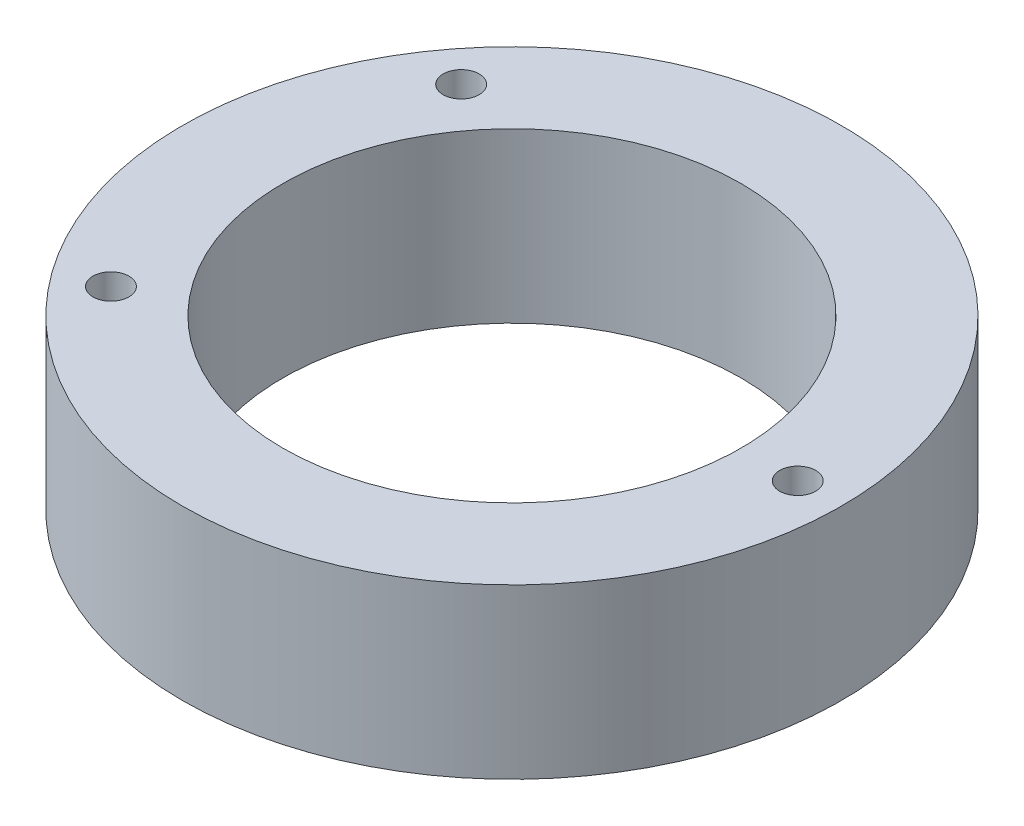
ISO-10303-21;
HEADER;
FILE_DESCRIPTION(('STEP AP214'),'2;1');
FILE_NAME('part.step','',(''),(''),'','','');
FILE_SCHEMA(('AUTOMOTIVE_DESIGN { 1 0 10303 214 1 1 1 1 }'));
ENDSEC;
DATA;
#1=APPLICATION_CONTEXT('core data for automotive mechanical design processes');
#2=APPLICATION_PROTOCOL_DEFINITION('international standard','automotive_design',2000,#1);
#3=PRODUCT_CONTEXT('',#1,'mechanical');
#4=PRODUCT('Part','Part','',(#3));
#5=PRODUCT_RELATED_PRODUCT_CATEGORY('part','',(#4));
#6=PRODUCT_DEFINITION_FORMATION('','',#4);
#7=PRODUCT_DEFINITION_CONTEXT('part definition',#1,'design');
#8=PRODUCT_DEFINITION('design','',#6,#7);
#9=PRODUCT_DEFINITION_SHAPE('','',#8);
#10=(LENGTH_UNIT() NAMED_UNIT(*) SI_UNIT(.MILLI.,.METRE.));
#11=(NAMED_UNIT(*) PLANE_ANGLE_UNIT() SI_UNIT($,.RADIAN.));
#12=(NAMED_UNIT(*) SI_UNIT($,.STERADIAN.) SOLID_ANGLE_UNIT());
#13=UNCERTAINTY_MEASURE_WITH_UNIT(LENGTH_MEASURE(1.E-05),#10,'distance_accuracy_value','');
#14=(GEOMETRIC_REPRESENTATION_CONTEXT(3) GLOBAL_UNCERTAINTY_ASSIGNED_CONTEXT((#13)) GLOBAL_UNIT_ASSIGNED_CONTEXT((#10,
#11,#12)) REPRESENTATION_CONTEXT('',''));
#15=CARTESIAN_POINT('',(0.,0.,0.));
#16=DIRECTION('',(0.,0.,1.));
#17=DIRECTION('',(1.,0.,0.));
#18=AXIS2_PLACEMENT_3D('',#15,#16,#17);
#19=CARTESIAN_POINT('',(0.,-3.35,0.));
#20=DIRECTION('',(0.,1.,0.));
#21=DIRECTION('',(0.,0.,1.));
#22=AXIS2_PLACEMENT_3D('',#19,#20,#21);
#23=CYLINDRICAL_SURFACE('',#22,32.);
#24=CARTESIAN_POINT('',(0.,-3.35,0.));
#25=DIRECTION('',(0.,1.,0.));
#26=DIRECTION('',(0.,0.,1.));
#27=AXIS2_PLACEMENT_3D('',#24,#25,#26);
#28=CIRCLE('',#27,32.);
#29=CARTESIAN_POINT('',(0.,-3.35,32.));
#30=VERTEX_POINT('',#29);
#31=EDGE_CURVE('E10',#30,#30,#28,.T.);
#32=ORIENTED_EDGE('',*,*,#31,.T.);
#33=EDGE_LOOP('',(#32));
#34=FACE_BOUND('',#33,.T.);
#35=CARTESIAN_POINT('',(0.,13.,0.));
#36=DIRECTION('',(0.,1.,0.));
#37=DIRECTION('',(0.,0.,1.));
#38=AXIS2_PLACEMENT_3D('',#35,#36,#37);
#39=CIRCLE('',#38,32.);
#40=CARTESIAN_POINT('',(0.,13.,32.));
#41=VERTEX_POINT('',#40);
#42=EDGE_CURVE('E65',#41,#41,#39,.T.);
#43=ORIENTED_EDGE('',*,*,#42,.F.);
#44=EDGE_LOOP('',(#43));
#45=FACE_BOUND('',#44,.T.);
#46=ADVANCED_FACE('F43',(#34,#45),#23,.T.);
#47=CARTESIAN_POINT('',(0.,-3.35,0.));
#48=DIRECTION('',(0.,1.,0.));
#49=DIRECTION('',(0.,0.,1.));
#50=AXIS2_PLACEMENT_3D('',#47,#48,#49);
#51=PLANE('',#50);
#52=CARTESIAN_POINT('',(-21.9312535706419,-3.35,17.0024297328413));
#53=DIRECTION('',(0.,1.,0.));
#54=DIRECTION('',(0.,0.,1.));
#55=AXIS2_PLACEMENT_3D('',#52,#53,#54);
#56=CIRCLE('',#55,1.75);
#57=CARTESIAN_POINT('',(-21.9312535706419,-3.35,18.7524297328413));
#58=VERTEX_POINT('',#57);
#59=EDGE_CURVE('E62',#58,#58,#56,.T.);
#60=ORIENTED_EDGE('',*,*,#59,.T.);
#61=EDGE_LOOP('',(#60));
#62=FACE_BOUND('',#61,.T.);
#63=CARTESIAN_POINT('',(-21.9312535706419,-3.35,-17.0024297328413));
#64=DIRECTION('',(0.,1.,0.));
#65=DIRECTION('',(0.,0.,1.));
#66=AXIS2_PLACEMENT_3D('',#63,#64,#65);
#67=CIRCLE('',#66,1.75);
#68=CARTESIAN_POINT('',(-21.9312535706419,-3.35,-15.2524297328413));
#69=VERTEX_POINT('',#68);
#70=EDGE_CURVE('E57',#69,#69,#67,.T.);
#71=ORIENTED_EDGE('',*,*,#70,.T.);
#72=EDGE_LOOP('',(#71));
#73=FACE_BOUND('',#72,.T.);
#74=CARTESIAN_POINT('',(27.75,-3.35,0.));
#75=DIRECTION('',(0.,1.,0.));
#76=DIRECTION('',(0.,0.,1.));
#77=AXIS2_PLACEMENT_3D('',#74,#75,#76);
#78=CIRCLE('',#77,1.75);
#79=CARTESIAN_POINT('',(27.75,-3.35,1.75));
#80=VERTEX_POINT('',#79);
#81=EDGE_CURVE('E53',#80,#80,#78,.T.);
#82=ORIENTED_EDGE('',*,*,#81,.T.);
#83=EDGE_LOOP('',(#82));
#84=FACE_BOUND('',#83,.T.);
#85=CARTESIAN_POINT('',(0.,-3.35,0.));
#86=DIRECTION('',(0.,1.,0.));
#87=DIRECTION('',(0.,0.,1.));
#88=AXIS2_PLACEMENT_3D('',#85,#86,#87);
#89=CIRCLE('',#88,22.25);
#90=CARTESIAN_POINT('',(0.,-3.35,22.25));
#91=VERTEX_POINT('',#90);
#92=EDGE_CURVE('E49',#91,#91,#89,.T.);
#93=ORIENTED_EDGE('',*,*,#92,.T.);
#94=EDGE_LOOP('',(#93));
#95=FACE_BOUND('',#94,.T.);
#96=ORIENTED_EDGE('',*,*,#31,.F.);
#97=EDGE_LOOP('',(#96));
#98=FACE_BOUND('',#97,.T.);
#99=ADVANCED_FACE('F96',(#62,#73,#84,#95,#98),#51,.F.);
#100=CARTESIAN_POINT('',(0.,-3.35,0.));
#101=DIRECTION('',(0.,1.,0.));
#102=DIRECTION('',(0.,0.,1.));
#103=AXIS2_PLACEMENT_3D('',#100,#101,#102);
#104=CYLINDRICAL_SURFACE('',#103,22.25);
#105=ORIENTED_EDGE('',*,*,#92,.F.);
#106=EDGE_LOOP('',(#105));
#107=FACE_BOUND('',#106,.T.);
#108=CARTESIAN_POINT('',(0.,13.,0.));
#109=DIRECTION('',(0.,1.,0.));
#110=DIRECTION('',(0.,0.,1.));
#111=AXIS2_PLACEMENT_3D('',#108,#109,#110);
#112=CIRCLE('',#111,22.25);
#113=CARTESIAN_POINT('',(0.,13.,22.25));
#114=VERTEX_POINT('',#113);
#115=EDGE_CURVE('E68',#114,#114,#112,.T.);
#116=ORIENTED_EDGE('',*,*,#115,.T.);
#117=EDGE_LOOP('',(#116));
#118=FACE_BOUND('',#117,.T.);
#119=ADVANCED_FACE('F100',(#107,#118),#104,.F.);
#120=CARTESIAN_POINT('',(27.75,-3.35,0.));
#121=DIRECTION('',(0.,1.,0.));
#122=DIRECTION('',(0.,0.,1.));
#123=AXIS2_PLACEMENT_3D('',#120,#121,#122);
#124=CYLINDRICAL_SURFACE('',#123,1.75);
#125=ORIENTED_EDGE('',*,*,#81,.F.);
#126=EDGE_LOOP('',(#125));
#127=FACE_BOUND('',#126,.T.);
#128=CARTESIAN_POINT('',(27.75,13.,0.));
#129=DIRECTION('',(0.,1.,0.));
#130=DIRECTION('',(0.,0.,1.));
#131=AXIS2_PLACEMENT_3D('',#128,#129,#130);
#132=CIRCLE('',#131,1.75);
#133=CARTESIAN_POINT('',(27.75,13.,1.75));
#134=VERTEX_POINT('',#133);
#135=EDGE_CURVE('E71',#134,#134,#132,.T.);
#136=ORIENTED_EDGE('',*,*,#135,.T.);
#137=EDGE_LOOP('',(#136));
#138=FACE_BOUND('',#137,.T.);
#139=ADVANCED_FACE('F108',(#127,#138),#124,.F.);
#140=CARTESIAN_POINT('',(-21.9312535706419,-3.35,-17.0024297328413));
#141=DIRECTION('',(0.,1.,0.));
#142=DIRECTION('',(0.,0.,1.));
#143=AXIS2_PLACEMENT_3D('',#140,#141,#142);
#144=CYLINDRICAL_SURFACE('',#143,1.75);
#145=ORIENTED_EDGE('',*,*,#70,.F.);
#146=EDGE_LOOP('',(#145));
#147=FACE_BOUND('',#146,.T.);
#148=CARTESIAN_POINT('',(-21.9312535706419,13.,-17.0024297328413));
#149=DIRECTION('',(0.,1.,0.));
#150=DIRECTION('',(0.,0.,1.));
#151=AXIS2_PLACEMENT_3D('',#148,#149,#150);
#152=CIRCLE('',#151,1.75);
#153=CARTESIAN_POINT('',(-21.9312535706419,13.,-15.2524297328413));
#154=VERTEX_POINT('',#153);
#155=EDGE_CURVE('E74',#154,#154,#152,.T.);
#156=ORIENTED_EDGE('',*,*,#155,.T.);
#157=EDGE_LOOP('',(#156));
#158=FACE_BOUND('',#157,.T.);
#159=ADVANCED_FACE('F90',(#147,#158),#144,.F.);
#160=CARTESIAN_POINT('',(-21.9312535706419,-3.35,17.0024297328413));
#161=DIRECTION('',(0.,1.,0.));
#162=DIRECTION('',(0.,0.,1.));
#163=AXIS2_PLACEMENT_3D('',#160,#161,#162);
#164=CYLINDRICAL_SURFACE('',#163,1.75);
#165=ORIENTED_EDGE('',*,*,#59,.F.);
#166=EDGE_LOOP('',(#165));
#167=FACE_BOUND('',#166,.T.);
#168=CARTESIAN_POINT('',(-21.9312535706419,13.,17.0024297328413));
#169=DIRECTION('',(0.,1.,0.));
#170=DIRECTION('',(0.,0.,1.));
#171=AXIS2_PLACEMENT_3D('',#168,#169,#170);
#172=CIRCLE('',#171,1.75);
#173=CARTESIAN_POINT('',(-21.9312535706419,13.,18.7524297328413));
#174=VERTEX_POINT('',#173);
#175=EDGE_CURVE('E77',#174,#174,#172,.T.);
#176=ORIENTED_EDGE('',*,*,#175,.T.);
#177=EDGE_LOOP('',(#176));
#178=FACE_BOUND('',#177,.T.);
#179=ADVANCED_FACE('F81',(#167,#178),#164,.F.);
#180=CARTESIAN_POINT('',(0.,13.,0.));
#181=DIRECTION('',(0.,1.,0.));
#182=DIRECTION('',(0.,0.,1.));
#183=AXIS2_PLACEMENT_3D('',#180,#181,#182);
#184=PLANE('',#183);
#185=ORIENTED_EDGE('',*,*,#155,.F.);
#186=EDGE_LOOP('',(#185));
#187=FACE_BOUND('',#186,.T.);
#188=ORIENTED_EDGE('',*,*,#115,.F.);
#189=EDGE_LOOP('',(#188));
#190=FACE_BOUND('',#189,.T.);
#191=ORIENTED_EDGE('',*,*,#42,.T.);
#192=EDGE_LOOP('',(#191));
#193=FACE_BOUND('',#192,.T.);
#194=ORIENTED_EDGE('',*,*,#135,.F.);
#195=EDGE_LOOP('',(#194));
#196=FACE_BOUND('',#195,.T.);
#197=ORIENTED_EDGE('',*,*,#175,.F.);
#198=EDGE_LOOP('',(#197));
#199=FACE_BOUND('',#198,.T.);
#200=ADVANCED_FACE('F83',(#187,#190,#193,#196,#199),#184,.T.);
#201=CLOSED_SHELL('',(#46,#99,#119,#139,#159,#179,#200));
#202=MANIFOLD_SOLID_BREP('B2',#201);
#203=ADVANCED_BREP_SHAPE_REPRESENTATION('',(#18,#202),#14);
#204=SHAPE_DEFINITION_REPRESENTATION(#9,#203);
ENDSEC;
END-ISO-10303-21;
